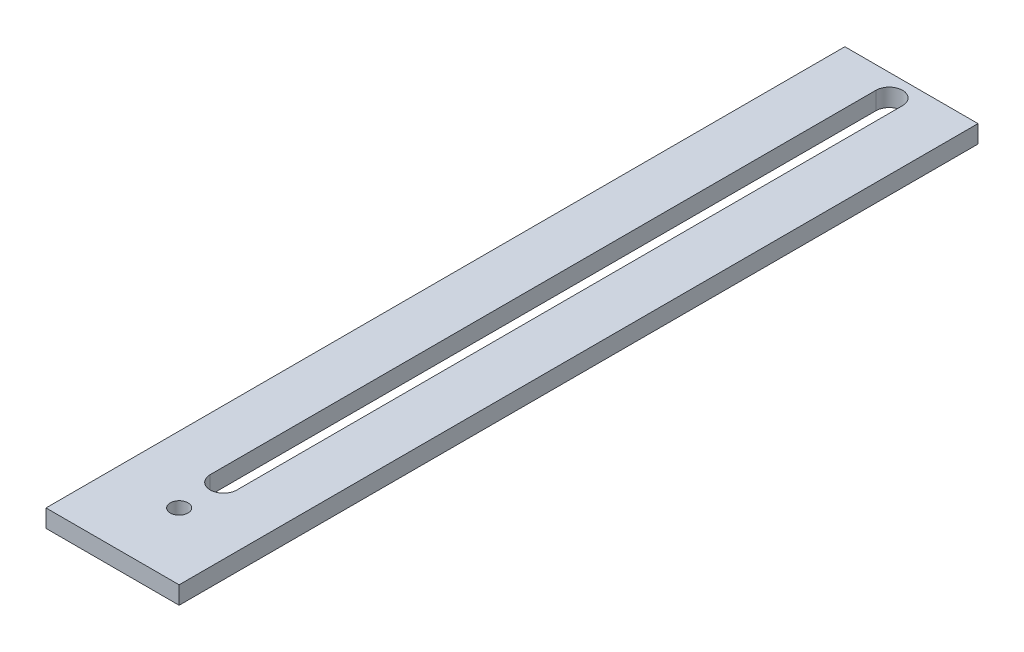
ISO-10303-21;
HEADER;
FILE_DESCRIPTION(('STEP AP214'),'2;1');
FILE_NAME('part.step','',(''),(''),'','','');
FILE_SCHEMA(('AUTOMOTIVE_DESIGN { 1 0 10303 214 1 1 1 1 }'));
ENDSEC;
DATA;
#1=APPLICATION_CONTEXT('core data for automotive mechanical design processes');
#2=APPLICATION_PROTOCOL_DEFINITION('international standard','automotive_design',2000,#1);
#3=PRODUCT_CONTEXT('',#1,'mechanical');
#4=PRODUCT('Part','Part','',(#3));
#5=PRODUCT_RELATED_PRODUCT_CATEGORY('part','',(#4));
#6=PRODUCT_DEFINITION_FORMATION('','',#4);
#7=PRODUCT_DEFINITION_CONTEXT('part definition',#1,'design');
#8=PRODUCT_DEFINITION('design','',#6,#7);
#9=PRODUCT_DEFINITION_SHAPE('','',#8);
#10=(LENGTH_UNIT() NAMED_UNIT(*) SI_UNIT(.MILLI.,.METRE.));
#11=(NAMED_UNIT(*) PLANE_ANGLE_UNIT() SI_UNIT($,.RADIAN.));
#12=(NAMED_UNIT(*) SI_UNIT($,.STERADIAN.) SOLID_ANGLE_UNIT());
#13=UNCERTAINTY_MEASURE_WITH_UNIT(LENGTH_MEASURE(1.E-05),#10,'distance_accuracy_value','');
#14=(GEOMETRIC_REPRESENTATION_CONTEXT(3) GLOBAL_UNCERTAINTY_ASSIGNED_CONTEXT((#13)) GLOBAL_UNIT_ASSIGNED_CONTEXT((#10,
#11,#12)) REPRESENTATION_CONTEXT('',''));
#15=CARTESIAN_POINT('',(0.,0.,0.));
#16=DIRECTION('',(0.,0.,1.));
#17=DIRECTION('',(1.,0.,0.));
#18=AXIS2_PLACEMENT_3D('',#15,#16,#17);
#19=CARTESIAN_POINT('',(0.,4.,0.));
#20=DIRECTION('',(0.,1.,0.));
#21=DIRECTION('',(0.,0.,1.));
#22=AXIS2_PLACEMENT_3D('',#19,#20,#21);
#23=PLANE('',#22);
#24=CARTESIAN_POINT('',(0.,4.,-10.));
#25=DIRECTION('',(0.,1.,0.));
#26=DIRECTION('',(0.,0.,1.));
#27=AXIS2_PLACEMENT_3D('',#24,#25,#26);
#28=CIRCLE('',#27,3.);
#29=CARTESIAN_POINT('',(-3.,4.,-10.));
#30=VERTEX_POINT('',#29);
#31=CARTESIAN_POINT('',(3.,4.,-10.));
#32=VERTEX_POINT('',#31);
#33=EDGE_CURVE('E48',#30,#32,#28,.T.);
#34=ORIENTED_EDGE('',*,*,#33,.F.);
#35=DIRECTION('',(0.,0.,1.));
#36=VECTOR('',#35,1.);
#37=CARTESIAN_POINT('',(-3.,4.,-10.));
#38=LINE('',#37,#36);
#39=CARTESIAN_POINT('',(-3.,4.,-160.));
#40=VERTEX_POINT('',#39);
#41=EDGE_CURVE('E116',#40,#30,#38,.T.);
#42=ORIENTED_EDGE('',*,*,#41,.F.);
#43=CARTESIAN_POINT('',(0.,4.,-160.));
#44=DIRECTION('',(0.,1.,0.));
#45=DIRECTION('',(0.,0.,1.));
#46=AXIS2_PLACEMENT_3D('',#43,#44,#45);
#47=CIRCLE('',#46,3.);
#48=CARTESIAN_POINT('',(3.,4.,-160.));
#49=VERTEX_POINT('',#48);
#50=EDGE_CURVE('E119',#49,#40,#47,.T.);
#51=ORIENTED_EDGE('',*,*,#50,.F.);
#52=DIRECTION('',(0.,0.,-1.));
#53=VECTOR('',#52,1.);
#54=CARTESIAN_POINT('',(3.,4.,-10.));
#55=LINE('',#54,#53);
#56=EDGE_CURVE('E125',#32,#49,#55,.T.);
#57=ORIENTED_EDGE('',*,*,#56,.F.);
#58=EDGE_LOOP('',(#34,#42,#51,#57));
#59=FACE_BOUND('',#58,.T.);
#60=DIRECTION('',(0.,0.,-1.));
#61=VECTOR('',#60,1.);
#62=CARTESIAN_POINT('',(15.,4.,-15.));
#63=LINE('',#62,#61);
#64=CARTESIAN_POINT('',(15.,4.,15.));
#65=VERTEX_POINT('',#64);
#66=CARTESIAN_POINT('',(15.,4.,-165.));
#67=VERTEX_POINT('',#66);
#68=EDGE_CURVE('E153',#65,#67,#63,.T.);
#69=ORIENTED_EDGE('',*,*,#68,.T.);
#70=DIRECTION('',(1.,0.,0.));
#71=VECTOR('',#70,1.);
#72=CARTESIAN_POINT('',(-15.,4.,-165.));
#73=LINE('',#72,#71);
#74=CARTESIAN_POINT('',(-15.,4.,-165.));
#75=VERTEX_POINT('',#74);
#76=EDGE_CURVE('E143',#75,#67,#73,.T.);
#77=ORIENTED_EDGE('',*,*,#76,.F.);
#78=DIRECTION('',(0.,0.,1.));
#79=VECTOR('',#78,1.);
#80=CARTESIAN_POINT('',(-15.,4.,-15.));
#81=LINE('',#80,#79);
#82=CARTESIAN_POINT('',(-15.,4.,15.));
#83=VERTEX_POINT('',#82);
#84=EDGE_CURVE('E155',#75,#83,#81,.T.);
#85=ORIENTED_EDGE('',*,*,#84,.T.);
#86=DIRECTION('',(1.,0.,0.));
#87=VECTOR('',#86,1.);
#88=CARTESIAN_POINT('',(-15.,4.,15.));
#89=LINE('',#88,#87);
#90=EDGE_CURVE('E158',#83,#65,#89,.T.);
#91=ORIENTED_EDGE('',*,*,#90,.T.);
#92=EDGE_LOOP('',(#69,#77,#85,#91));
#93=FACE_BOUND('',#92,.T.);
#94=CARTESIAN_POINT('',(0.,4.,0.));
#95=DIRECTION('',(0.,1.,0.));
#96=DIRECTION('',(0.,0.,1.));
#97=AXIS2_PLACEMENT_3D('',#94,#95,#96);
#98=CIRCLE('',#97,2.);
#99=CARTESIAN_POINT('',(0.,4.,2.));
#100=VERTEX_POINT('',#99);
#101=EDGE_CURVE('E147',#100,#100,#98,.T.);
#102=ORIENTED_EDGE('',*,*,#101,.F.);
#103=EDGE_LOOP('',(#102));
#104=FACE_BOUND('',#103,.T.);
#105=ADVANCED_FACE('F33',(#59,#93,#104),#23,.T.);
#106=CARTESIAN_POINT('',(0.,0.,0.));
#107=DIRECTION('',(0.,1.,0.));
#108=DIRECTION('',(0.,0.,1.));
#109=AXIS2_PLACEMENT_3D('',#106,#107,#108);
#110=PLANE('',#109);
#111=DIRECTION('',(0.,0.,1.));
#112=VECTOR('',#111,1.);
#113=CARTESIAN_POINT('',(-3.,0.,-10.));
#114=LINE('',#113,#112);
#115=CARTESIAN_POINT('',(-3.,0.,-160.));
#116=VERTEX_POINT('',#115);
#117=CARTESIAN_POINT('',(-3.,0.,-10.));
#118=VERTEX_POINT('',#117);
#119=EDGE_CURVE('E106',#116,#118,#114,.T.);
#120=ORIENTED_EDGE('',*,*,#119,.T.);
#121=CARTESIAN_POINT('',(0.,0.,-10.));
#122=DIRECTION('',(0.,1.,0.));
#123=DIRECTION('',(0.,0.,1.));
#124=AXIS2_PLACEMENT_3D('',#121,#122,#123);
#125=CIRCLE('',#124,3.);
#126=CARTESIAN_POINT('',(3.,0.,-10.));
#127=VERTEX_POINT('',#126);
#128=EDGE_CURVE('E100',#118,#127,#125,.T.);
#129=ORIENTED_EDGE('',*,*,#128,.T.);
#130=DIRECTION('',(0.,0.,-1.));
#131=VECTOR('',#130,1.);
#132=CARTESIAN_POINT('',(3.,0.,-10.));
#133=LINE('',#132,#131);
#134=CARTESIAN_POINT('',(3.,0.,-160.));
#135=VERTEX_POINT('',#134);
#136=EDGE_CURVE('E109',#127,#135,#133,.T.);
#137=ORIENTED_EDGE('',*,*,#136,.T.);
#138=CARTESIAN_POINT('',(0.,0.,-160.));
#139=DIRECTION('',(0.,1.,0.));
#140=DIRECTION('',(0.,0.,1.));
#141=AXIS2_PLACEMENT_3D('',#138,#139,#140);
#142=CIRCLE('',#141,3.);
#143=EDGE_CURVE('E56',#135,#116,#142,.T.);
#144=ORIENTED_EDGE('',*,*,#143,.T.);
#145=EDGE_LOOP('',(#120,#129,#137,#144));
#146=FACE_BOUND('',#145,.T.);
#147=DIRECTION('',(0.,0.,-1.));
#148=VECTOR('',#147,1.);
#149=CARTESIAN_POINT('',(15.,0.,-15.));
#150=LINE('',#149,#148);
#151=CARTESIAN_POINT('',(15.,0.,15.));
#152=VERTEX_POINT('',#151);
#153=CARTESIAN_POINT('',(15.,0.,-165.));
#154=VERTEX_POINT('',#153);
#155=EDGE_CURVE('E150',#152,#154,#150,.T.);
#156=ORIENTED_EDGE('',*,*,#155,.F.);
#157=DIRECTION('',(1.,0.,0.));
#158=VECTOR('',#157,1.);
#159=CARTESIAN_POINT('',(-15.,0.,15.));
#160=LINE('',#159,#158);
#161=CARTESIAN_POINT('',(-15.,0.,15.));
#162=VERTEX_POINT('',#161);
#163=EDGE_CURVE('E156',#162,#152,#160,.T.);
#164=ORIENTED_EDGE('',*,*,#163,.F.);
#165=DIRECTION('',(0.,0.,1.));
#166=VECTOR('',#165,1.);
#167=CARTESIAN_POINT('',(-15.,0.,-15.));
#168=LINE('',#167,#166);
#169=CARTESIAN_POINT('',(-15.,0.,-165.));
#170=VERTEX_POINT('',#169);
#171=EDGE_CURVE('E161',#170,#162,#168,.T.);
#172=ORIENTED_EDGE('',*,*,#171,.F.);
#173=DIRECTION('',(-1.,0.,0.));
#174=VECTOR('',#173,1.);
#175=CARTESIAN_POINT('',(15.,0.,-165.));
#176=LINE('',#175,#174);
#177=EDGE_CURVE('E137',#154,#170,#176,.T.);
#178=ORIENTED_EDGE('',*,*,#177,.F.);
#179=EDGE_LOOP('',(#156,#164,#172,#178));
#180=FACE_BOUND('',#179,.T.);
#181=CARTESIAN_POINT('',(0.,0.,0.));
#182=DIRECTION('',(0.,1.,0.));
#183=DIRECTION('',(0.,0.,1.));
#184=AXIS2_PLACEMENT_3D('',#181,#182,#183);
#185=CIRCLE('',#184,2.);
#186=CARTESIAN_POINT('',(0.,0.,2.));
#187=VERTEX_POINT('',#186);
#188=EDGE_CURVE('E146',#187,#187,#185,.T.);
#189=ORIENTED_EDGE('',*,*,#188,.T.);
#190=EDGE_LOOP('',(#189));
#191=FACE_BOUND('',#190,.T.);
#192=ADVANCED_FACE('F113',(#146,#180,#191),#110,.F.);
#193=CARTESIAN_POINT('',(15.,4.,-15.));
#194=DIRECTION('',(-1.,0.,0.));
#195=DIRECTION('',(0.,0.,1.));
#196=AXIS2_PLACEMENT_3D('',#193,#194,#195);
#197=PLANE('',#196);
#198=ORIENTED_EDGE('',*,*,#155,.T.);
#199=DIRECTION('',(0.,-1.,0.));
#200=VECTOR('',#199,1.);
#201=CARTESIAN_POINT('',(15.,4.,-165.));
#202=LINE('',#201,#200);
#203=EDGE_CURVE('E131',#67,#154,#202,.T.);
#204=ORIENTED_EDGE('',*,*,#203,.F.);
#205=ORIENTED_EDGE('',*,*,#68,.F.);
#206=DIRECTION('',(0.,-1.,0.));
#207=VECTOR('',#206,1.);
#208=CARTESIAN_POINT('',(15.,4.,15.));
#209=LINE('',#208,#207);
#210=EDGE_CURVE('E41',#65,#152,#209,.T.);
#211=ORIENTED_EDGE('',*,*,#210,.T.);
#212=EDGE_LOOP('',(#198,#204,#205,#211));
#213=FACE_BOUND('',#212,.T.);
#214=ADVANCED_FACE('F35',(#213),#197,.F.);
#215=CARTESIAN_POINT('',(-15.,4.,-15.));
#216=DIRECTION('',(1.,0.,0.));
#217=DIRECTION('',(0.,0.,-1.));
#218=AXIS2_PLACEMENT_3D('',#215,#216,#217);
#219=PLANE('',#218);
#220=ORIENTED_EDGE('',*,*,#171,.T.);
#221=DIRECTION('',(0.,-1.,0.));
#222=VECTOR('',#221,1.);
#223=CARTESIAN_POINT('',(-15.,4.,15.));
#224=LINE('',#223,#222);
#225=EDGE_CURVE('E11',#83,#162,#224,.T.);
#226=ORIENTED_EDGE('',*,*,#225,.F.);
#227=ORIENTED_EDGE('',*,*,#84,.F.);
#228=DIRECTION('',(0.,1.,0.));
#229=VECTOR('',#228,1.);
#230=CARTESIAN_POINT('',(-15.,0.,-165.));
#231=LINE('',#230,#229);
#232=EDGE_CURVE('E140',#170,#75,#231,.T.);
#233=ORIENTED_EDGE('',*,*,#232,.F.);
#234=EDGE_LOOP('',(#220,#226,#227,#233));
#235=FACE_BOUND('',#234,.T.);
#236=ADVANCED_FACE('F183',(#235),#219,.F.);
#237=CARTESIAN_POINT('',(-15.,4.,15.));
#238=DIRECTION('',(0.,0.,-1.));
#239=DIRECTION('',(-1.,0.,0.));
#240=AXIS2_PLACEMENT_3D('',#237,#238,#239);
#241=PLANE('',#240);
#242=ORIENTED_EDGE('',*,*,#163,.T.);
#243=ORIENTED_EDGE('',*,*,#210,.F.);
#244=ORIENTED_EDGE('',*,*,#90,.F.);
#245=ORIENTED_EDGE('',*,*,#225,.T.);
#246=EDGE_LOOP('',(#242,#243,#244,#245));
#247=FACE_BOUND('',#246,.T.);
#248=ADVANCED_FACE('F181',(#247),#241,.F.);
#249=CARTESIAN_POINT('',(0.,4.,0.));
#250=DIRECTION('',(0.,-1.,0.));
#251=DIRECTION('',(0.,0.,-1.));
#252=AXIS2_PLACEMENT_3D('',#249,#250,#251);
#253=CYLINDRICAL_SURFACE('',#252,2.);
#254=ORIENTED_EDGE('',*,*,#101,.T.);
#255=EDGE_LOOP('',(#254));
#256=FACE_BOUND('',#255,.T.);
#257=ORIENTED_EDGE('',*,*,#188,.F.);
#258=EDGE_LOOP('',(#257));
#259=FACE_BOUND('',#258,.T.);
#260=ADVANCED_FACE('F190',(#256,#259),#253,.F.);
#261=CARTESIAN_POINT('',(0.,0.,-165.));
#262=DIRECTION('',(0.,0.,-1.));
#263=DIRECTION('',(-1.,0.,0.));
#264=AXIS2_PLACEMENT_3D('',#261,#262,#263);
#265=PLANE('',#264);
#266=ORIENTED_EDGE('',*,*,#203,.T.);
#267=ORIENTED_EDGE('',*,*,#177,.T.);
#268=ORIENTED_EDGE('',*,*,#232,.T.);
#269=ORIENTED_EDGE('',*,*,#76,.T.);
#270=EDGE_LOOP('',(#266,#267,#268,#269));
#271=FACE_BOUND('',#270,.T.);
#272=ADVANCED_FACE('F176',(#271),#265,.T.);
#273=CARTESIAN_POINT('',(0.,0.,-10.));
#274=DIRECTION('',(0.,1.,0.));
#275=DIRECTION('',(0.,0.,1.));
#276=AXIS2_PLACEMENT_3D('',#273,#274,#275);
#277=CYLINDRICAL_SURFACE('',#276,3.);
#278=ORIENTED_EDGE('',*,*,#33,.T.);
#279=DIRECTION('',(0.,1.,0.));
#280=VECTOR('',#279,1.);
#281=CARTESIAN_POINT('',(3.,0.,-10.));
#282=LINE('',#281,#280);
#283=EDGE_CURVE('E96',#127,#32,#282,.T.);
#284=ORIENTED_EDGE('',*,*,#283,.F.);
#285=ORIENTED_EDGE('',*,*,#128,.F.);
#286=DIRECTION('',(0.,1.,0.));
#287=VECTOR('',#286,1.);
#288=CARTESIAN_POINT('',(-3.,0.,-10.));
#289=LINE('',#288,#287);
#290=EDGE_CURVE('E129',#118,#30,#289,.T.);
#291=ORIENTED_EDGE('',*,*,#290,.T.);
#292=EDGE_LOOP('',(#278,#284,#285,#291));
#293=FACE_BOUND('',#292,.T.);
#294=ADVANCED_FACE('F98',(#293),#277,.F.);
#295=CARTESIAN_POINT('',(-3.,0.,-10.));
#296=DIRECTION('',(-1.,0.,0.));
#297=DIRECTION('',(0.,0.,1.));
#298=AXIS2_PLACEMENT_3D('',#295,#296,#297);
#299=PLANE('',#298);
#300=ORIENTED_EDGE('',*,*,#41,.T.);
#301=ORIENTED_EDGE('',*,*,#290,.F.);
#302=ORIENTED_EDGE('',*,*,#119,.F.);
#303=DIRECTION('',(0.,1.,0.));
#304=VECTOR('',#303,1.);
#305=CARTESIAN_POINT('',(-3.,0.,-160.));
#306=LINE('',#305,#304);
#307=EDGE_CURVE('E132',#116,#40,#306,.T.);
#308=ORIENTED_EDGE('',*,*,#307,.T.);
#309=EDGE_LOOP('',(#300,#301,#302,#308));
#310=FACE_BOUND('',#309,.T.);
#311=ADVANCED_FACE('F206',(#310),#299,.F.);
#312=CARTESIAN_POINT('',(0.,0.,-160.));
#313=DIRECTION('',(0.,1.,0.));
#314=DIRECTION('',(0.,0.,1.));
#315=AXIS2_PLACEMENT_3D('',#312,#313,#314);
#316=CYLINDRICAL_SURFACE('',#315,3.);
#317=ORIENTED_EDGE('',*,*,#50,.T.);
#318=ORIENTED_EDGE('',*,*,#307,.F.);
#319=ORIENTED_EDGE('',*,*,#143,.F.);
#320=DIRECTION('',(0.,1.,0.));
#321=VECTOR('',#320,1.);
#322=CARTESIAN_POINT('',(3.,0.,-160.));
#323=LINE('',#322,#321);
#324=EDGE_CURVE('E105',#135,#49,#323,.T.);
#325=ORIENTED_EDGE('',*,*,#324,.T.);
#326=EDGE_LOOP('',(#317,#318,#319,#325));
#327=FACE_BOUND('',#326,.T.);
#328=ADVANCED_FACE('F209',(#327),#316,.F.);
#329=CARTESIAN_POINT('',(3.,0.,-10.));
#330=DIRECTION('',(1.,0.,0.));
#331=DIRECTION('',(0.,0.,-1.));
#332=AXIS2_PLACEMENT_3D('',#329,#330,#331);
#333=PLANE('',#332);
#334=ORIENTED_EDGE('',*,*,#56,.T.);
#335=ORIENTED_EDGE('',*,*,#324,.F.);
#336=ORIENTED_EDGE('',*,*,#136,.F.);
#337=ORIENTED_EDGE('',*,*,#283,.T.);
#338=EDGE_LOOP('',(#334,#335,#336,#337));
#339=FACE_BOUND('',#338,.T.);
#340=ADVANCED_FACE('F110',(#339),#333,.F.);
#341=CLOSED_SHELL('',(#105,#192,#214,#236,#248,#260,#272,#294,#311,#328,#340));
#342=MANIFOLD_SOLID_BREP('B2',#341);
#343=ADVANCED_BREP_SHAPE_REPRESENTATION('',(#18,#342),#14);
#344=SHAPE_DEFINITION_REPRESENTATION(#9,#343);
ENDSEC;
END-ISO-10303-21;
